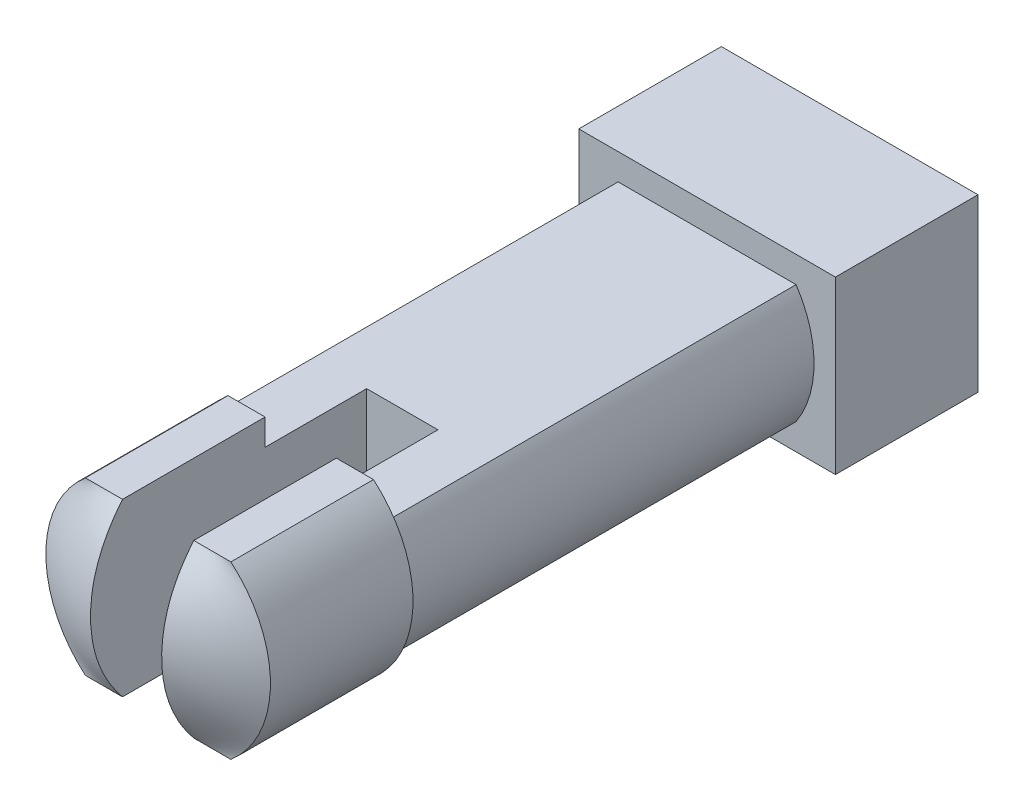
ISO-10303-21;
HEADER;
FILE_DESCRIPTION(('STEP AP214'),'2;1');
FILE_NAME('part.step','',(''),(''),'','','');
FILE_SCHEMA(('AUTOMOTIVE_DESIGN { 1 0 10303 214 1 1 1 1 }'));
ENDSEC;
DATA;
#1=APPLICATION_CONTEXT('core data for automotive mechanical design processes');
#2=APPLICATION_PROTOCOL_DEFINITION('international standard','automotive_design',2000,#1);
#3=PRODUCT_CONTEXT('',#1,'mechanical');
#4=PRODUCT('Part','Part','',(#3));
#5=PRODUCT_RELATED_PRODUCT_CATEGORY('part','',(#4));
#6=PRODUCT_DEFINITION_FORMATION('','',#4);
#7=PRODUCT_DEFINITION_CONTEXT('part definition',#1,'design');
#8=PRODUCT_DEFINITION('design','',#6,#7);
#9=PRODUCT_DEFINITION_SHAPE('','',#8);
#10=(LENGTH_UNIT() NAMED_UNIT(*) SI_UNIT(.MILLI.,.METRE.));
#11=(NAMED_UNIT(*) PLANE_ANGLE_UNIT() SI_UNIT($,.RADIAN.));
#12=(NAMED_UNIT(*) SI_UNIT($,.STERADIAN.) SOLID_ANGLE_UNIT());
#13=UNCERTAINTY_MEASURE_WITH_UNIT(LENGTH_MEASURE(1.E-05),#10,'distance_accuracy_value','');
#14=(GEOMETRIC_REPRESENTATION_CONTEXT(3) GLOBAL_UNCERTAINTY_ASSIGNED_CONTEXT((#13)) GLOBAL_UNIT_ASSIGNED_CONTEXT((#10,
#11,#12)) REPRESENTATION_CONTEXT('',''));
#15=CARTESIAN_POINT('',(0.,0.,0.));
#16=DIRECTION('',(0.,0.,1.));
#17=DIRECTION('',(1.,0.,0.));
#18=AXIS2_PLACEMENT_3D('',#15,#16,#17);
#19=CARTESIAN_POINT('',(0.,0.,19.558));
#20=DIRECTION('',(0.,0.,-1.));
#21=DIRECTION('',(-1.,0.,0.));
#22=AXIS2_PLACEMENT_3D('',#19,#20,#21);
#23=PLANE('',#22);
#24=DIRECTION('',(0.,-1.,0.));
#25=VECTOR('',#24,1.);
#26=CARTESIAN_POINT('',(1.27,0.,19.558));
#27=LINE('',#26,#25);
#28=CARTESIAN_POINT('',(1.27,3.048,19.558));
#29=VERTEX_POINT('',#28);
#30=CARTESIAN_POINT('',(1.27,2.11340774761812,19.558));
#31=VERTEX_POINT('',#30);
#32=EDGE_CURVE('E599',#29,#31,#27,.T.);
#33=ORIENTED_EDGE('',*,*,#32,.F.);
#34=DIRECTION('',(-1.,0.,0.));
#35=VECTOR('',#34,1.);
#36=CARTESIAN_POINT('',(-4.572,3.048,19.558));
#37=LINE('',#36,#35);
#38=CARTESIAN_POINT('',(2.5910801319141,3.048,19.558));
#39=VERTEX_POINT('',#38);
#40=EDGE_CURVE('E65',#39,#29,#37,.T.);
#41=ORIENTED_EDGE('',*,*,#40,.F.);
#42=CARTESIAN_POINT('',(0.,0.,19.558));
#43=DIRECTION('',(0.,0.,-1.));
#44=DIRECTION('',(-1.,0.,0.));
#45=AXIS2_PLACEMENT_3D('',#42,#43,#44);
#46=CIRCLE('',#45,4.0005);
#47=CARTESIAN_POINT('',(2.5910801319141,-3.048,19.558));
#48=VERTEX_POINT('',#47);
#49=EDGE_CURVE('E165',#39,#48,#46,.T.);
#50=ORIENTED_EDGE('',*,*,#49,.T.);
#51=DIRECTION('',(1.,0.,0.));
#52=VECTOR('',#51,1.);
#53=CARTESIAN_POINT('',(4.572,-3.048,19.558));
#54=LINE('',#53,#52);
#55=CARTESIAN_POINT('',(1.27,-3.048,19.558));
#56=VERTEX_POINT('',#55);
#57=EDGE_CURVE('E276',#56,#48,#54,.T.);
#58=ORIENTED_EDGE('',*,*,#57,.F.);
#59=CARTESIAN_POINT('',(1.27,-2.11340774761813,19.558));
#60=VERTEX_POINT('',#59);
#61=EDGE_CURVE('E597',#60,#56,#27,.T.);
#62=ORIENTED_EDGE('',*,*,#61,.F.);
#63=DIRECTION('',(1.,0.,0.));
#64=VECTOR('',#63,1.);
#65=CARTESIAN_POINT('',(-3.17011162142718,-2.11340774761813,19.558));
#66=LINE('',#65,#64);
#67=CARTESIAN_POINT('',(3.17011162142718,-2.11340774761812,19.558));
#68=VERTEX_POINT('',#67);
#69=EDGE_CURVE('E304',#60,#68,#66,.T.);
#70=ORIENTED_EDGE('',*,*,#69,.T.);
#71=CARTESIAN_POINT('',(0.,0.,19.558));
#72=DIRECTION('',(0.,0.,1.));
#73=DIRECTION('',(-1.,0.,0.));
#74=AXIS2_PLACEMENT_3D('',#71,#72,#73);
#75=CIRCLE('',#74,3.81);
#76=CARTESIAN_POINT('',(3.17011162142718,2.11340774761812,19.558));
#77=VERTEX_POINT('',#76);
#78=EDGE_CURVE('E306',#68,#77,#75,.T.);
#79=ORIENTED_EDGE('',*,*,#78,.T.);
#80=DIRECTION('',(-1.,0.,0.));
#81=VECTOR('',#80,1.);
#82=CARTESIAN_POINT('',(-3.17011162142718,2.11340774761812,19.558));
#83=LINE('',#82,#81);
#84=EDGE_CURVE('E310',#77,#31,#83,.T.);
#85=ORIENTED_EDGE('',*,*,#84,.T.);
#86=EDGE_LOOP('',(#33,#41,#50,#58,#62,#70,#79,#85));
#87=FACE_BOUND('',#86,.T.);
#88=ADVANCED_FACE('F38',(#87),#23,.T.);
#89=CARTESIAN_POINT('',(-2.5910801319141,-3.048,24.638));
#90=CARTESIAN_POINT('',(-0.863693377304702,-3.048,24.638));
#91=CARTESIAN_POINT('',(0.8636933773047,-3.048,24.638));
#92=CARTESIAN_POINT('',(2.5910801319141,-3.048,24.638));
#93=CARTESIAN_POINT('',(-4.6145251321818,-1.32788578142567,24.638));
#94=CARTESIAN_POINT('',(-1.5381750440606,-1.32788578142567,27.050654692375));
#95=CARTESIAN_POINT('',(1.5381750440606,-1.32788578142567,27.050654692375));
#96=CARTESIAN_POINT('',(4.61452513218179,-1.32788578142568,24.638));
#97=CARTESIAN_POINT('',(-4.61452513218179,1.32788578142568,24.638));
#98=CARTESIAN_POINT('',(-1.5381750440606,1.32788578142567,27.050654692375));
#99=CARTESIAN_POINT('',(1.5381750440606,1.32788578142567,27.1242265482653));
#100=CARTESIAN_POINT('',(4.6145251321818,1.32788578142567,24.638));
#101=CARTESIAN_POINT('',(-2.5910801319141,3.048,24.638));
#102=CARTESIAN_POINT('',(-0.8636933773047,3.048,24.638));
#103=CARTESIAN_POINT('',(0.863693377304702,3.048,24.638));
#104=CARTESIAN_POINT('',(2.5910801319141,3.048,24.638));
#105=(BOUNDED_SURFACE() B_SPLINE_SURFACE(3,3,((#89,#90,#91,#92),(#93,#94,#95,#96),(#97,#98,#99,
#100),(#101,#102,#103,#104)),.UNSPECIFIED.,.F.,.F.,.F.) B_SPLINE_SURFACE_WITH_KNOTS((4,4),(4,4),
(0.,1.),(0.,1.),.UNSPECIFIED.) GEOMETRIC_REPRESENTATION_ITEM() RATIONAL_B_SPLINE_SURFACE(((1.,
1.,1.,1.),(0.765126047896363,0.765126047896363,0.765126047896363,0.765126047896363),
(0.765126047896363,0.765126047896363,0.765126047896363,0.765126047896363),(1.,1.,1.,1.))) REPRESENTATION_ITEM('') SURFACE());
#106=CARTESIAN_POINT('',(1.27,-3.048,24.638));
#107=CARTESIAN_POINT('',(1.27,-3.00458500327321,24.6727504949667));
#108=CARTESIAN_POINT('',(1.27,-2.96089386099959,24.7071678880411));
#109=CARTESIAN_POINT('',(1.27,-2.87277313021113,24.775065923737));
#110=CARTESIAN_POINT('',(1.27,-2.82834335373755,24.8085463219221));
#111=CARTESIAN_POINT('',(1.27,-2.73848121865672,24.8743549790353));
#112=CARTESIAN_POINT('',(1.27,-2.6930468423728,24.9066804975642));
#113=CARTESIAN_POINT('',(1.27,-2.60122505357584,24.9699366480647));
#114=CARTESIAN_POINT('',(1.27,-2.5548377248211,25.0008674018699));
#115=CARTESIAN_POINT('',(1.27,-2.41416166654985,25.0914039420115));
#116=CARTESIAN_POINT('',(1.27,-2.31838770303796,25.1487326810203));
#117=CARTESIAN_POINT('',(1.27,-2.1231359077627,25.2565843633799));
#118=CARTESIAN_POINT('',(1.27,-2.02365969101949,25.307110230917));
#119=CARTESIAN_POINT('',(1.27,-1.82142861075274,25.4009111229785));
#120=CARTESIAN_POINT('',(1.27,-1.71867624235521,25.4441915157311));
#121=CARTESIAN_POINT('',(1.27,-1.51036995869101,25.5232069511139));
#122=CARTESIAN_POINT('',(1.27,-1.40481743066164,25.558945654223));
#123=CARTESIAN_POINT('',(1.27,-1.17476183536036,25.6276419702737));
#124=CARTESIAN_POINT('',(1.27,-1.04986799923013,25.6592991992556));
#125=CARTESIAN_POINT('',(1.27,-0.797856778005628,25.7120102227014));
#126=CARTESIAN_POINT('',(1.27,-0.670739226822252,25.733063221607));
#127=CARTESIAN_POINT('',(1.27,-0.415425316148469,25.7643686092299));
#128=CARTESIAN_POINT('',(1.27,-0.287231472276336,25.7746414910539));
#129=CARTESIAN_POINT('',(1.27,-0.0304419777011619,25.7843607403967));
#130=CARTESIAN_POINT('',(1.27,0.0981536457452551,25.7838078270466));
#131=CARTESIAN_POINT('',(1.27,0.354927267616464,25.7718421648942));
#132=CARTESIAN_POINT('',(1.27,0.483104923298805,25.7604220445866));
#133=CARTESIAN_POINT('',(1.27,0.738042304453518,25.7267457290753));
#134=CARTESIAN_POINT('',(1.27,0.864801904369178,25.7044885819931));
#135=CARTESIAN_POINT('',(1.27,1.1161545138105,25.6492133789829));
#136=CARTESIAN_POINT('',(1.27,1.24074390972599,25.6161789026141));
#137=CARTESIAN_POINT('',(1.27,1.48662350229105,25.5395769671217));
#138=CARTESIAN_POINT('',(1.27,1.60791442176924,25.49601183672));
#139=CARTESIAN_POINT('',(1.27,1.80716908005208,25.4146973178181));
#140=CARTESIAN_POINT('',(1.27,1.88628367518884,25.3797344950019));
#141=CARTESIAN_POINT('',(1.27,2.04241936238761,25.3053714340232));
#142=CARTESIAN_POINT('',(1.27,2.11944012188005,25.2659704959957));
#143=CARTESIAN_POINT('',(1.27,2.27119990842214,25.1829306203223));
#144=CARTESIAN_POINT('',(1.27,2.34593793652381,25.1392898612444));
#145=CARTESIAN_POINT('',(1.27,2.49285760700231,25.0481370435275));
#146=CARTESIAN_POINT('',(1.27,2.56504293690192,25.0006309262613));
#147=CARTESIAN_POINT('',(1.27,2.67147551471115,24.9267554758278));
#148=CARTESIAN_POINT('',(1.27,2.70664202406715,24.9016969339871));
#149=CARTESIAN_POINT('',(1.27,2.77639365783714,24.8507787067752));
#150=CARTESIAN_POINT('',(1.27,2.81097875428177,24.8249189830315));
#151=CARTESIAN_POINT('',(1.27,2.87955692575336,24.7725290632499));
#152=CARTESIAN_POINT('',(1.27000000000001,2.91355077699303,24.745999879389));
#153=CARTESIAN_POINT('',(1.26999999999999,2.98108798649202,24.6923834060631));
#154=CARTESIAN_POINT('',(1.26999999999995,3.01463140976077,24.6652961985984));
#155=CARTESIAN_POINT('',(1.26999999999987,3.048,24.638));
#156=B_SPLINE_CURVE_WITH_KNOTS('',3,(#106,#107,#108,#109,#110,#111,#112,#113,#114,#115,#116,
#117,#118,#119,#120,#121,#122,#123,#124,#125,#126,#127,#128,#129,#130,#131,#132,#133,#134,#135,
#136,#137,#138,#139,#140,#141,#142,#143,#144,#145,#146,#147,#148,#149,#150,#151,#152,#153,#154,
#155),.UNSPECIFIED.,.F.,.F.,(4,2,2,2,2,2,2,2,2,2,2,2,2,2,2,2,2,2,2,2,2,2,2,2,4),(0.,
0.166839293265474,0.333721712141065,0.500976872944534,0.668217395479844,1.00280584715987,
1.33725001505932,1.67144528338264,2.00547796972887,2.39154290804202,2.77763680568337,
3.16299539806703,3.5483283921058,3.93392295385967,4.31955139071602,4.70577014028944,
5.09190356044414,5.35126285185365,5.6106631001248,5.87017528399577,6.12929585048003,
6.25883005810055,6.38837047934608,6.51772556711767,6.64706178018432),.UNSPECIFIED.);
#157=CARTESIAN_POINT('',(1.27,-3.048,24.638));
#158=VERTEX_POINT('',#157);
#159=CARTESIAN_POINT('',(1.27,3.048,24.638));
#160=VERTEX_POINT('',#159);
#161=EDGE_CURVE('E197',#158,#160,#156,.T.);
#162=DIRECTION('',(1.,0.,0.));
#163=VECTOR('',#162,1.);
#164=CARTESIAN_POINT('',(-2.5910801319141,-3.048,24.638));
#165=LINE('',#164,#163);
#166=CARTESIAN_POINT('',(2.5910801319141,-3.048,24.638));
#167=VERTEX_POINT('',#166);
#168=EDGE_CURVE('E170',#158,#167,#165,.T.);
#169=CARTESIAN_POINT('',(0.,0.,24.638));
#170=DIRECTION('',(0.,0.,1.));
#171=DIRECTION('',(-1.,0.,0.));
#172=AXIS2_PLACEMENT_3D('',#169,#170,#171);
#173=CIRCLE('',#172,4.0005);
#174=CARTESIAN_POINT('',(2.5910801319141,3.048,24.638));
#175=VERTEX_POINT('',#174);
#176=EDGE_CURVE('E177',#167,#175,#173,.T.);
#177=DIRECTION('',(-1.,0.,0.));
#178=VECTOR('',#177,1.);
#179=CARTESIAN_POINT('',(-2.5910801319141,3.048,24.638));
#180=LINE('',#179,#178);
#181=EDGE_CURVE('E172',#175,#160,#180,.T.);
#182=ORIENTED_EDGE('',*,*,#161,.F.);
#183=ORIENTED_EDGE('',*,*,#168,.T.);
#184=ORIENTED_EDGE('',*,*,#176,.T.);
#185=ORIENTED_EDGE('',*,*,#181,.T.);
#186=EDGE_LOOP('',(#182,#183,#184,#185));
#187=FACE_BOUND('',#186,.T.);
#188=ADVANCED_FACE('F195',(#187),#105,.F.);
#189=CARTESIAN_POINT('',(-4.572,-3.048,5.08));
#190=DIRECTION('',(0.,1.,0.));
#191=DIRECTION('',(0.,0.,1.));
#192=AXIS2_PLACEMENT_3D('',#189,#190,#191);
#193=PLANE('',#192);
#194=ORIENTED_EDGE('',*,*,#168,.F.);
#195=DIRECTION('',(0.,0.,1.));
#196=VECTOR('',#195,1.);
#197=CARTESIAN_POINT('',(1.27,-3.048,15.9385));
#198=LINE('',#197,#196);
#199=EDGE_CURVE('E388',#56,#158,#198,.T.);
#200=ORIENTED_EDGE('',*,*,#199,.F.);
#201=ORIENTED_EDGE('',*,*,#57,.T.);
#202=DIRECTION('',(0.,0.,-1.));
#203=VECTOR('',#202,1.);
#204=CARTESIAN_POINT('',(2.5910801319141,-3.048,24.638));
#205=LINE('',#204,#203);
#206=EDGE_CURVE('E154',#167,#48,#205,.T.);
#207=ORIENTED_EDGE('',*,*,#206,.F.);
#208=EDGE_LOOP('',(#194,#200,#201,#207));
#209=FACE_BOUND('',#208,.T.);
#210=ADVANCED_FACE('F238',(#209),#193,.F.);
#211=CARTESIAN_POINT('',(-4.572,3.048,5.08));
#212=DIRECTION('',(0.,-1.,0.));
#213=DIRECTION('',(0.,0.,-1.));
#214=AXIS2_PLACEMENT_3D('',#211,#212,#213);
#215=PLANE('',#214);
#216=ORIENTED_EDGE('',*,*,#40,.T.);
#217=DIRECTION('',(0.,0.,1.));
#218=VECTOR('',#217,1.);
#219=CARTESIAN_POINT('',(1.27,3.048,5.08));
#220=LINE('',#219,#218);
#221=EDGE_CURVE('E49',#29,#160,#220,.T.);
#222=ORIENTED_EDGE('',*,*,#221,.T.);
#223=ORIENTED_EDGE('',*,*,#181,.F.);
#224=DIRECTION('',(0.,0.,-1.));
#225=VECTOR('',#224,1.);
#226=CARTESIAN_POINT('',(2.5910801319141,3.048,24.638));
#227=LINE('',#226,#225);
#228=EDGE_CURVE('E204',#175,#39,#227,.T.);
#229=ORIENTED_EDGE('',*,*,#228,.T.);
#230=EDGE_LOOP('',(#216,#222,#223,#229));
#231=FACE_BOUND('',#230,.T.);
#232=ADVANCED_FACE('F185',(#231),#215,.F.);
#233=DIRECTION('',(0.,0.,-1.));
#234=VECTOR('',#233,1.);
#235=CARTESIAN_POINT('',(-4.572,3.048,5.08));
#236=LINE('',#235,#234);
#237=CARTESIAN_POINT('',(-4.572,3.048,5.08));
#238=VERTEX_POINT('',#237);
#239=CARTESIAN_POINT('',(-4.572,3.048,0.));
#240=VERTEX_POINT('',#239);
#241=EDGE_CURVE('E161',#238,#240,#236,.T.);
#242=ORIENTED_EDGE('',*,*,#241,.F.);
#243=DIRECTION('',(-1.,0.,0.));
#244=VECTOR('',#243,1.);
#245=CARTESIAN_POINT('',(-4.572,3.048,5.08));
#246=LINE('',#245,#244);
#247=CARTESIAN_POINT('',(4.572,3.048,5.08));
#248=VERTEX_POINT('',#247);
#249=EDGE_CURVE('E213',#248,#238,#246,.T.);
#250=ORIENTED_EDGE('',*,*,#249,.F.);
#251=DIRECTION('',(0.,0.,-1.));
#252=VECTOR('',#251,1.);
#253=CARTESIAN_POINT('',(4.572,3.048,5.08));
#254=LINE('',#253,#252);
#255=CARTESIAN_POINT('',(4.572,3.048,0.));
#256=VERTEX_POINT('',#255);
#257=EDGE_CURVE('E163',#248,#256,#254,.T.);
#258=ORIENTED_EDGE('',*,*,#257,.T.);
#259=DIRECTION('',(-1.,0.,0.));
#260=VECTOR('',#259,1.);
#261=CARTESIAN_POINT('',(-4.572,3.048,0.));
#262=LINE('',#261,#260);
#263=EDGE_CURVE('E149',#256,#240,#262,.T.);
#264=ORIENTED_EDGE('',*,*,#263,.T.);
#265=EDGE_LOOP('',(#242,#250,#258,#264));
#266=FACE_BOUND('',#265,.T.);
#267=ADVANCED_FACE('F221',(#266),#215,.F.);
#268=DIRECTION('',(0.,0.,-1.));
#269=VECTOR('',#268,1.);
#270=CARTESIAN_POINT('',(4.572,-3.048,5.08));
#271=LINE('',#270,#269);
#272=CARTESIAN_POINT('',(4.572,-3.048,5.08));
#273=VERTEX_POINT('',#272);
#274=CARTESIAN_POINT('',(4.572,-3.048,0.));
#275=VERTEX_POINT('',#274);
#276=EDGE_CURVE('E133',#273,#275,#271,.T.);
#277=ORIENTED_EDGE('',*,*,#276,.F.);
#278=DIRECTION('',(1.,0.,0.));
#279=VECTOR('',#278,1.);
#280=CARTESIAN_POINT('',(-4.572,-3.048,5.08));
#281=LINE('',#280,#279);
#282=CARTESIAN_POINT('',(-4.572,-3.048,5.08));
#283=VERTEX_POINT('',#282);
#284=EDGE_CURVE('E146',#283,#273,#281,.T.);
#285=ORIENTED_EDGE('',*,*,#284,.F.);
#286=DIRECTION('',(0.,0.,-1.));
#287=VECTOR('',#286,1.);
#288=CARTESIAN_POINT('',(-4.572,-3.048,5.08));
#289=LINE('',#288,#287);
#290=CARTESIAN_POINT('',(-4.572,-3.048,0.));
#291=VERTEX_POINT('',#290);
#292=EDGE_CURVE('E135',#283,#291,#289,.T.);
#293=ORIENTED_EDGE('',*,*,#292,.T.);
#294=DIRECTION('',(1.,0.,0.));
#295=VECTOR('',#294,1.);
#296=CARTESIAN_POINT('',(-4.572,-3.048,0.));
#297=LINE('',#296,#295);
#298=EDGE_CURVE('E129',#291,#275,#297,.T.);
#299=ORIENTED_EDGE('',*,*,#298,.T.);
#300=EDGE_LOOP('',(#277,#285,#293,#299));
#301=FACE_BOUND('',#300,.T.);
#302=ADVANCED_FACE('F131',(#301),#193,.F.);
#303=CARTESIAN_POINT('',(4.572,3.048,5.08));
#304=DIRECTION('',(-1.,0.,0.));
#305=DIRECTION('',(0.,0.,1.));
#306=AXIS2_PLACEMENT_3D('',#303,#304,#305);
#307=PLANE('',#306);
#308=DIRECTION('',(0.,1.,0.));
#309=VECTOR('',#308,1.);
#310=CARTESIAN_POINT('',(4.572,3.048,0.));
#311=LINE('',#310,#309);
#312=EDGE_CURVE('E144',#275,#256,#311,.T.);
#313=ORIENTED_EDGE('',*,*,#312,.T.);
#314=ORIENTED_EDGE('',*,*,#257,.F.);
#315=DIRECTION('',(0.,1.,0.));
#316=VECTOR('',#315,1.);
#317=CARTESIAN_POINT('',(4.572,3.048,5.08));
#318=LINE('',#317,#316);
#319=EDGE_CURVE('E138',#273,#248,#318,.T.);
#320=ORIENTED_EDGE('',*,*,#319,.F.);
#321=ORIENTED_EDGE('',*,*,#276,.T.);
#322=EDGE_LOOP('',(#313,#314,#320,#321));
#323=FACE_BOUND('',#322,.T.);
#324=ADVANCED_FACE('F142',(#323),#307,.F.);
#325=CARTESIAN_POINT('',(-4.572,3.048,5.08));
#326=DIRECTION('',(1.,0.,0.));
#327=DIRECTION('',(0.,1.,0.));
#328=AXIS2_PLACEMENT_3D('',#325,#326,#327);
#329=PLANE('',#328);
#330=DIRECTION('',(0.,-1.,0.));
#331=VECTOR('',#330,1.);
#332=CARTESIAN_POINT('',(-4.572,3.048,0.));
#333=LINE('',#332,#331);
#334=EDGE_CURVE('E123',#240,#291,#333,.T.);
#335=ORIENTED_EDGE('',*,*,#334,.T.);
#336=ORIENTED_EDGE('',*,*,#292,.F.);
#337=DIRECTION('',(0.,-1.,0.));
#338=VECTOR('',#337,1.);
#339=CARTESIAN_POINT('',(-4.572,3.048,5.08));
#340=LINE('',#339,#338);
#341=EDGE_CURVE('E214',#238,#283,#340,.T.);
#342=ORIENTED_EDGE('',*,*,#341,.F.);
#343=ORIENTED_EDGE('',*,*,#241,.T.);
#344=EDGE_LOOP('',(#335,#336,#342,#343));
#345=FACE_BOUND('',#344,.T.);
#346=ADVANCED_FACE('F222',(#345),#329,.F.);
#347=CARTESIAN_POINT('',(0.,0.,5.08));
#348=DIRECTION('',(0.,0.,1.));
#349=DIRECTION('',(1.,0.,0.));
#350=AXIS2_PLACEMENT_3D('',#347,#348,#349);
#351=PLANE('',#350);
#352=ORIENTED_EDGE('',*,*,#249,.T.);
#353=ORIENTED_EDGE('',*,*,#341,.T.);
#354=ORIENTED_EDGE('',*,*,#284,.T.);
#355=ORIENTED_EDGE('',*,*,#319,.T.);
#356=EDGE_LOOP('',(#352,#353,#354,#355));
#357=FACE_BOUND('',#356,.T.);
#358=DIRECTION('',(-1.,0.,0.));
#359=VECTOR('',#358,1.);
#360=CARTESIAN_POINT('',(-3.17011162142718,-2.11340774761813,5.08));
#361=LINE('',#360,#359);
#362=CARTESIAN_POINT('',(3.17011162142718,-2.11340774761813,5.08));
#363=VERTEX_POINT('',#362);
#364=CARTESIAN_POINT('',(-3.17011162142718,-2.11340774761813,5.08));
#365=VERTEX_POINT('',#364);
#366=EDGE_CURVE('E284',#363,#365,#361,.T.);
#367=ORIENTED_EDGE('',*,*,#366,.T.);
#368=CARTESIAN_POINT('',(0.,0.,5.08));
#369=DIRECTION('',(0.,0.,1.));
#370=DIRECTION('',(1.,0.,0.));
#371=AXIS2_PLACEMENT_3D('',#368,#369,#370);
#372=CIRCLE('',#371,3.81);
#373=CARTESIAN_POINT('',(-3.17011162142718,2.11340774761812,5.08));
#374=VERTEX_POINT('',#373);
#375=EDGE_CURVE('E286',#365,#374,#372,.F.);
#376=ORIENTED_EDGE('',*,*,#375,.T.);
#377=DIRECTION('',(1.,0.,0.));
#378=VECTOR('',#377,1.);
#379=CARTESIAN_POINT('',(-3.17011162142718,2.11340774761812,5.08));
#380=LINE('',#379,#378);
#381=CARTESIAN_POINT('',(3.17011162142718,2.11340774761812,5.08));
#382=VERTEX_POINT('',#381);
#383=EDGE_CURVE('E289',#374,#382,#380,.T.);
#384=ORIENTED_EDGE('',*,*,#383,.T.);
#385=CARTESIAN_POINT('',(0.,0.,5.08));
#386=DIRECTION('',(0.,0.,1.));
#387=DIRECTION('',(1.,0.,0.));
#388=AXIS2_PLACEMENT_3D('',#385,#386,#387);
#389=CIRCLE('',#388,3.81);
#390=EDGE_CURVE('E287',#382,#363,#389,.F.);
#391=ORIENTED_EDGE('',*,*,#390,.T.);
#392=EDGE_LOOP('',(#367,#376,#384,#391));
#393=FACE_BOUND('',#392,.T.);
#394=ADVANCED_FACE('F217',(#357,#393),#351,.T.);
#395=CARTESIAN_POINT('',(0.,0.,0.));
#396=DIRECTION('',(0.,0.,1.));
#397=DIRECTION('',(1.,0.,0.));
#398=AXIS2_PLACEMENT_3D('',#395,#396,#397);
#399=PLANE('',#398);
#400=ORIENTED_EDGE('',*,*,#312,.F.);
#401=ORIENTED_EDGE('',*,*,#298,.F.);
#402=ORIENTED_EDGE('',*,*,#334,.F.);
#403=ORIENTED_EDGE('',*,*,#263,.F.);
#404=EDGE_LOOP('',(#400,#401,#402,#403));
#405=FACE_BOUND('',#404,.T.);
#406=ADVANCED_FACE('F148',(#405),#399,.F.);
#407=DIRECTION('',(0.,1.,0.));
#408=VECTOR('',#407,1.);
#409=CARTESIAN_POINT('',(-1.27,0.,19.558));
#410=LINE('',#409,#408);
#411=CARTESIAN_POINT('',(-1.27,-3.048,19.558));
#412=VERTEX_POINT('',#411);
#413=CARTESIAN_POINT('',(-1.27,-2.11340774761813,19.558));
#414=VERTEX_POINT('',#413);
#415=EDGE_CURVE('E257',#412,#414,#410,.T.);
#416=ORIENTED_EDGE('',*,*,#415,.F.);
#417=CARTESIAN_POINT('',(-2.5910801319141,-3.048,19.558));
#418=VERTEX_POINT('',#417);
#419=EDGE_CURVE('E259',#418,#412,#54,.T.);
#420=ORIENTED_EDGE('',*,*,#419,.F.);
#421=CARTESIAN_POINT('',(0.,0.,19.558));
#422=DIRECTION('',(0.,0.,-1.));
#423=DIRECTION('',(-1.,0.,0.));
#424=AXIS2_PLACEMENT_3D('',#421,#422,#423);
#425=CIRCLE('',#424,4.0005);
#426=CARTESIAN_POINT('',(-2.5910801319141,3.048,19.558));
#427=VERTEX_POINT('',#426);
#428=EDGE_CURVE('E171',#418,#427,#425,.T.);
#429=ORIENTED_EDGE('',*,*,#428,.T.);
#430=CARTESIAN_POINT('',(-1.27,3.048,19.558));
#431=VERTEX_POINT('',#430);
#432=EDGE_CURVE('E98',#431,#427,#37,.T.);
#433=ORIENTED_EDGE('',*,*,#432,.F.);
#434=CARTESIAN_POINT('',(-1.27,2.11340774761812,19.558));
#435=VERTEX_POINT('',#434);
#436=EDGE_CURVE('E56',#435,#431,#410,.T.);
#437=ORIENTED_EDGE('',*,*,#436,.F.);
#438=CARTESIAN_POINT('',(-3.17011162142718,2.11340774761812,19.558));
#439=VERTEX_POINT('',#438);
#440=EDGE_CURVE('E309',#435,#439,#83,.T.);
#441=ORIENTED_EDGE('',*,*,#440,.T.);
#442=CARTESIAN_POINT('',(0.,0.,19.558));
#443=DIRECTION('',(0.,0.,1.));
#444=DIRECTION('',(1.,0.,0.));
#445=AXIS2_PLACEMENT_3D('',#442,#443,#444);
#446=CIRCLE('',#445,3.81);
#447=CARTESIAN_POINT('',(-3.17011162142718,-2.11340774761813,19.558));
#448=VERTEX_POINT('',#447);
#449=EDGE_CURVE('E302',#439,#448,#446,.T.);
#450=ORIENTED_EDGE('',*,*,#449,.T.);
#451=EDGE_CURVE('E264',#448,#414,#66,.T.);
#452=ORIENTED_EDGE('',*,*,#451,.T.);
#453=EDGE_LOOP('',(#416,#420,#429,#433,#437,#441,#450,#452));
#454=FACE_BOUND('',#453,.T.);
#455=ADVANCED_FACE('F234',(#454),#23,.T.);
#456=CARTESIAN_POINT('',(-3.17011162142718,-2.11340774761813,-5.90972028761424));
#457=DIRECTION('',(0.,-1.,0.));
#458=DIRECTION('',(0.,0.,-1.));
#459=AXIS2_PLACEMENT_3D('',#456,#457,#458);
#460=PLANE('',#459);
#461=DIRECTION('',(0.,0.,1.));
#462=VECTOR('',#461,1.);
#463=CARTESIAN_POINT('',(1.27,-2.11340774761813,-5.90972028761424));
#464=LINE('',#463,#462);
#465=CARTESIAN_POINT('',(1.27,-2.11340774761813,15.9385));
#466=VERTEX_POINT('',#465);
#467=EDGE_CURVE('E598',#466,#60,#464,.T.);
#468=ORIENTED_EDGE('',*,*,#467,.F.);
#469=DIRECTION('',(1.,0.,0.));
#470=VECTOR('',#469,1.);
#471=CARTESIAN_POINT('',(-3.17011162142718,-2.11340774761813,15.9385));
#472=LINE('',#471,#470);
#473=CARTESIAN_POINT('',(-1.27,-2.11340774761813,15.9385));
#474=VERTEX_POINT('',#473);
#475=EDGE_CURVE('E297',#474,#466,#472,.T.);
#476=ORIENTED_EDGE('',*,*,#475,.F.);
#477=DIRECTION('',(0.,0.,-1.));
#478=VECTOR('',#477,1.);
#479=CARTESIAN_POINT('',(-1.27,-2.11340774761813,-5.90972028761424));
#480=LINE('',#479,#478);
#481=EDGE_CURVE('E271',#414,#474,#480,.T.);
#482=ORIENTED_EDGE('',*,*,#481,.F.);
#483=ORIENTED_EDGE('',*,*,#451,.F.);
#484=DIRECTION('',(0.,0.,1.));
#485=VECTOR('',#484,1.);
#486=CARTESIAN_POINT('',(-3.17011162142718,-2.11340774761813,-5.90972028761424));
#487=LINE('',#486,#485);
#488=EDGE_CURVE('E281',#365,#448,#487,.T.);
#489=ORIENTED_EDGE('',*,*,#488,.F.);
#490=ORIENTED_EDGE('',*,*,#366,.F.);
#491=DIRECTION('',(0.,0.,1.));
#492=VECTOR('',#491,1.);
#493=CARTESIAN_POINT('',(3.17011162142718,-2.11340774761812,-5.90972028761424));
#494=LINE('',#493,#492);
#495=EDGE_CURVE('E317',#363,#68,#494,.T.);
#496=ORIENTED_EDGE('',*,*,#495,.T.);
#497=ORIENTED_EDGE('',*,*,#69,.F.);
#498=EDGE_LOOP('',(#468,#476,#482,#483,#489,#490,#496,#497));
#499=FACE_BOUND('',#498,.T.);
#500=ADVANCED_FACE('F242',(#499),#460,.T.);
#501=CARTESIAN_POINT('',(0.,0.,-5.90972028761424));
#502=DIRECTION('',(0.,0.,1.));
#503=DIRECTION('',(1.,0.,0.));
#504=AXIS2_PLACEMENT_3D('',#501,#502,#503);
#505=CYLINDRICAL_SURFACE('',#504,3.81);
#506=DIRECTION('',(0.,0.,1.));
#507=VECTOR('',#506,1.);
#508=CARTESIAN_POINT('',(3.17011162142718,2.11340774761812,-5.90972028761424));
#509=LINE('',#508,#507);
#510=EDGE_CURVE('E315',#382,#77,#509,.T.);
#511=ORIENTED_EDGE('',*,*,#510,.T.);
#512=ORIENTED_EDGE('',*,*,#78,.F.);
#513=ORIENTED_EDGE('',*,*,#495,.F.);
#514=ORIENTED_EDGE('',*,*,#390,.F.);
#515=EDGE_LOOP('',(#511,#512,#513,#514));
#516=FACE_BOUND('',#515,.T.);
#517=ADVANCED_FACE('F248',(#516),#505,.T.);
#518=CARTESIAN_POINT('',(-3.17011162142718,2.11340774761812,-5.90972028761424));
#519=DIRECTION('',(0.,1.,0.));
#520=DIRECTION('',(-1.,0.,0.));
#521=AXIS2_PLACEMENT_3D('',#518,#519,#520);
#522=PLANE('',#521);
#523=DIRECTION('',(0.,0.,-1.));
#524=VECTOR('',#523,1.);
#525=CARTESIAN_POINT('',(1.27,2.11340774761812,-5.90972028761424));
#526=LINE('',#525,#524);
#527=CARTESIAN_POINT('',(1.27,2.11340774761812,15.9385));
#528=VERTEX_POINT('',#527);
#529=EDGE_CURVE('E355',#31,#528,#526,.T.);
#530=ORIENTED_EDGE('',*,*,#529,.F.);
#531=ORIENTED_EDGE('',*,*,#84,.F.);
#532=ORIENTED_EDGE('',*,*,#510,.F.);
#533=ORIENTED_EDGE('',*,*,#383,.F.);
#534=DIRECTION('',(0.,0.,1.));
#535=VECTOR('',#534,1.);
#536=CARTESIAN_POINT('',(-3.17011162142718,2.11340774761812,-5.90972028761424));
#537=LINE('',#536,#535);
#538=EDGE_CURVE('E279',#374,#439,#537,.T.);
#539=ORIENTED_EDGE('',*,*,#538,.T.);
#540=ORIENTED_EDGE('',*,*,#440,.F.);
#541=DIRECTION('',(0.,0.,1.));
#542=VECTOR('',#541,1.);
#543=CARTESIAN_POINT('',(-1.27,2.11340774761812,-5.90972028761424));
#544=LINE('',#543,#542);
#545=CARTESIAN_POINT('',(-1.27,2.11340774761812,15.9385));
#546=VERTEX_POINT('',#545);
#547=EDGE_CURVE('E346',#546,#435,#544,.T.);
#548=ORIENTED_EDGE('',*,*,#547,.F.);
#549=DIRECTION('',(-1.,0.,0.));
#550=VECTOR('',#549,1.);
#551=CARTESIAN_POINT('',(-3.17011162142718,2.11340774761812,15.9385));
#552=LINE('',#551,#550);
#553=EDGE_CURVE('E11',#528,#546,#552,.T.);
#554=ORIENTED_EDGE('',*,*,#553,.F.);
#555=EDGE_LOOP('',(#530,#531,#532,#533,#539,#540,#548,#554));
#556=FACE_BOUND('',#555,.T.);
#557=ADVANCED_FACE('F366',(#556),#522,.T.);
#558=CARTESIAN_POINT('',(0.,0.,-5.90972028761424));
#559=DIRECTION('',(0.,0.,1.));
#560=DIRECTION('',(1.,0.,0.));
#561=AXIS2_PLACEMENT_3D('',#558,#559,#560);
#562=CYLINDRICAL_SURFACE('',#561,3.81);
#563=ORIENTED_EDGE('',*,*,#488,.T.);
#564=ORIENTED_EDGE('',*,*,#449,.F.);
#565=ORIENTED_EDGE('',*,*,#538,.F.);
#566=ORIENTED_EDGE('',*,*,#375,.F.);
#567=EDGE_LOOP('',(#563,#564,#565,#566));
#568=FACE_BOUND('',#567,.T.);
#569=ADVANCED_FACE('F329',(#568),#562,.T.);
#570=CARTESIAN_POINT('',(-1.27,3.048,24.638));
#571=CARTESIAN_POINT('',(-1.27,3.00541540902938,24.6723485216203));
#572=CARTESIAN_POINT('',(-1.27,2.96255477866502,24.7063662981467));
#573=CARTESIAN_POINT('',(-1.27,2.87610092037041,24.7734791723055));
#574=CARTESIAN_POINT('',(-1.27,2.83250750727115,24.8065740309301));
#575=CARTESIAN_POINT('',(-1.27,2.744333203988,24.8716328391362));
#576=CARTESIAN_POINT('',(-1.27,2.69975036761388,24.903594164995));
#577=CARTESIAN_POINT('',(-1.27,2.60964285208239,24.9661490007697));
#578=CARTESIAN_POINT('',(-1.27,2.56411825486159,24.9967426289543));
#579=CARTESIAN_POINT('',(-1.27,2.42604992405147,25.086309487261));
#580=CARTESIAN_POINT('',(-1.27,2.33203777238801,25.1430492289848));
#581=CARTESIAN_POINT('',(-1.27,2.14042140303452,25.2498042465661));
#582=CARTESIAN_POINT('',(-1.27,2.0428217234857,25.2998276692071));
#583=CARTESIAN_POINT('',(-1.27,1.84437546520534,25.3927674428047));
#584=CARTESIAN_POINT('',(-1.27,1.74353130993547,25.4356889577863));
#585=CARTESIAN_POINT('',(-1.27,1.53906656327599,25.5141440137061));
#586=CARTESIAN_POINT('',(-1.27,1.43544729755185,25.54968101358));
#587=CARTESIAN_POINT('',(-1.27,1.20759103950463,25.6187355734139));
#588=CARTESIAN_POINT('',(-1.27,1.08291532181485,25.6508150760783));
#589=CARTESIAN_POINT('',(-1.27,0.831289841571873,25.7043026484292));
#590=CARTESIAN_POINT('',(-1.27,0.704339876884446,25.7257097646342));
#591=CARTESIAN_POINT('',(-1.27,0.449306480273879,25.7577020796041));
#592=CARTESIAN_POINT('',(-1.27,0.321225389048588,25.7683059351983));
#593=CARTESIAN_POINT('',(-1.27,0.0646351154392668,25.7787121750421));
#594=CARTESIAN_POINT('',(-1.27,-0.0638740367124837,25.7785153065824));
#595=CARTESIAN_POINT('',(-1.27,-0.320394646637235,25.7673464629178));
#596=CARTESIAN_POINT('',(-1.27,-0.448406207367436,25.756376850536));
#597=CARTESIAN_POINT('',(-1.27,-0.703071257576576,25.7237517652908));
#598=CARTESIAN_POINT('',(-1.27,-0.829724629347547,25.7020953737793));
#599=CARTESIAN_POINT('',(-1.27,-1.08097565653142,25.6482100720807));
#600=CARTESIAN_POINT('',(-1.27,-1.2055696684552,25.6159641728815));
#601=CARTESIAN_POINT('',(-1.27,-1.45159365824385,25.5411601853379));
#602=CARTESIAN_POINT('',(-1.27,-1.57302427620981,25.4986042014359));
#603=CARTESIAN_POINT('',(-1.27,-1.81545284698904,25.4021321546333));
#604=CARTESIAN_POINT('',(-1.27,-1.93633186324191,25.3479174245186));
#605=CARTESIAN_POINT('',(-1.27,-2.17315569103077,25.2294724872682));
#606=CARTESIAN_POINT('',(-1.27,-2.2890981136584,25.1652374997164));
#607=CARTESIAN_POINT('',(-1.27,-2.45873711144829,25.0621742076297));
#608=CARTESIAN_POINT('',(-1.27,-2.51452531611022,25.0267343320078));
#609=CARTESIAN_POINT('',(-1.27,-2.62473421469734,24.9537696596849));
#610=CARTESIAN_POINT('',(-1.27,-2.67915473220432,24.9162445959995));
#611=CARTESIAN_POINT('',(-1.27,-2.78661001077214,24.8393965363952));
#612=CARTESIAN_POINT('',(-1.26999999999999,-2.83964631615198,24.8000756916497));
#613=CARTESIAN_POINT('',(-1.27000000000001,-2.91834561035208,24.740000281134));
#614=CARTESIAN_POINT('',(-1.27000000000002,-2.94443205534603,24.7197961236192));
#615=CARTESIAN_POINT('',(-1.26999999999998,-2.99637477175617,24.6790974439287));
#616=CARTESIAN_POINT('',(-1.26999999999994,-3.02223105887957,24.658602941819));
#617=CARTESIAN_POINT('',(-1.26999999999984,-3.048,24.638));
#618=B_SPLINE_CURVE_WITH_KNOTS('',3,(#570,#571,#572,#573,#574,#575,#576,#577,#578,#579,#580,
#581,#582,#583,#584,#585,#586,#587,#588,#589,#590,#591,#592,#593,#594,#595,#596,#597,#598,#599,
#600,#601,#602,#603,#604,#605,#606,#607,#608,#609,#610,#611,#612,#613,#614,#615,#616,#617),
.UNSPECIFIED.,.F.,.F.,(4,2,2,2,2,2,2,2,2,2,2,2,2,2,2,2,2,2,2,2,2,2,2,4),(0.,0.164141590336763,
0.328325300922407,0.492867068620794,0.657394580310217,0.986547150740211,1.31529678626858,
1.64380631677584,1.97216162354552,2.35789581076287,2.74366445367939,3.12876575339649,
3.51384040839071,3.89883062249125,4.28385393656319,4.66949799571776,5.05506340537685,
5.45202823973283,5.84918303863789,6.04742313124518,6.2456886649814,6.44372262500954,
6.54270777827328,6.64168612365511),.UNSPECIFIED.);
#619=CARTESIAN_POINT('',(-1.27,3.048,24.638));
#620=VERTEX_POINT('',#619);
#621=CARTESIAN_POINT('',(-1.27,-3.048,24.638));
#622=VERTEX_POINT('',#621);
#623=EDGE_CURVE('E385',#620,#622,#618,.T.);
#624=CARTESIAN_POINT('',(-2.5910801319141,3.048,24.638));
#625=VERTEX_POINT('',#624);
#626=EDGE_CURVE('E176',#620,#625,#180,.T.);
#627=CARTESIAN_POINT('',(0.,0.,24.638));
#628=DIRECTION('',(0.,0.,1.));
#629=DIRECTION('',(1.,0.,0.));
#630=AXIS2_PLACEMENT_3D('',#627,#628,#629);
#631=CIRCLE('',#630,4.0005);
#632=CARTESIAN_POINT('',(-2.5910801319141,-3.048,24.638));
#633=VERTEX_POINT('',#632);
#634=EDGE_CURVE('E168',#625,#633,#631,.T.);
#635=EDGE_CURVE('E90',#633,#622,#165,.T.);
#636=ORIENTED_EDGE('',*,*,#623,.F.);
#637=ORIENTED_EDGE('',*,*,#626,.T.);
#638=ORIENTED_EDGE('',*,*,#634,.T.);
#639=ORIENTED_EDGE('',*,*,#635,.T.);
#640=EDGE_LOOP('',(#636,#637,#638,#639));
#641=FACE_BOUND('',#640,.T.);
#642=ADVANCED_FACE('F40',(#641),#105,.F.);
#643=CARTESIAN_POINT('',(0.,0.,24.638));
#644=DIRECTION('',(0.,0.,-1.));
#645=DIRECTION('',(-1.,0.,0.));
#646=AXIS2_PLACEMENT_3D('',#643,#644,#645);
#647=CYLINDRICAL_SURFACE('',#646,4.0005);
#648=ORIENTED_EDGE('',*,*,#428,.F.);
#649=DIRECTION('',(0.,0.,-1.));
#650=VECTOR('',#649,1.);
#651=CARTESIAN_POINT('',(-2.5910801319141,-3.048,24.638));
#652=LINE('',#651,#650);
#653=EDGE_CURVE('E151',#633,#418,#652,.T.);
#654=ORIENTED_EDGE('',*,*,#653,.F.);
#655=ORIENTED_EDGE('',*,*,#634,.F.);
#656=DIRECTION('',(0.,0.,-1.));
#657=VECTOR('',#656,1.);
#658=CARTESIAN_POINT('',(-2.5910801319141,3.048,24.638));
#659=LINE('',#658,#657);
#660=EDGE_CURVE('E175',#625,#427,#659,.T.);
#661=ORIENTED_EDGE('',*,*,#660,.T.);
#662=EDGE_LOOP('',(#648,#654,#655,#661));
#663=FACE_BOUND('',#662,.T.);
#664=ADVANCED_FACE('F376',(#663),#647,.T.);
#665=CARTESIAN_POINT('',(0.,0.,24.638));
#666=DIRECTION('',(0.,0.,-1.));
#667=DIRECTION('',(-1.,0.,0.));
#668=AXIS2_PLACEMENT_3D('',#665,#666,#667);
#669=CYLINDRICAL_SURFACE('',#668,4.0005);
#670=ORIENTED_EDGE('',*,*,#49,.F.);
#671=ORIENTED_EDGE('',*,*,#228,.F.);
#672=ORIENTED_EDGE('',*,*,#176,.F.);
#673=ORIENTED_EDGE('',*,*,#206,.T.);
#674=EDGE_LOOP('',(#670,#671,#672,#673));
#675=FACE_BOUND('',#674,.T.);
#676=ADVANCED_FACE('F205',(#675),#669,.T.);
#677=ORIENTED_EDGE('',*,*,#419,.T.);
#678=DIRECTION('',(0.,0.,-1.));
#679=VECTOR('',#678,1.);
#680=CARTESIAN_POINT('',(-1.27,-3.048,15.9385));
#681=LINE('',#680,#679);
#682=EDGE_CURVE('E274',#622,#412,#681,.T.);
#683=ORIENTED_EDGE('',*,*,#682,.F.);
#684=ORIENTED_EDGE('',*,*,#635,.F.);
#685=ORIENTED_EDGE('',*,*,#653,.T.);
#686=EDGE_LOOP('',(#677,#683,#684,#685));
#687=FACE_BOUND('',#686,.T.);
#688=ADVANCED_FACE('F273',(#687),#193,.F.);
#689=ORIENTED_EDGE('',*,*,#626,.F.);
#690=DIRECTION('',(0.,0.,-1.));
#691=VECTOR('',#690,1.);
#692=CARTESIAN_POINT('',(-1.27,3.048,5.08));
#693=LINE('',#692,#691);
#694=EDGE_CURVE('E167',#620,#431,#693,.T.);
#695=ORIENTED_EDGE('',*,*,#694,.T.);
#696=ORIENTED_EDGE('',*,*,#432,.T.);
#697=ORIENTED_EDGE('',*,*,#660,.F.);
#698=EDGE_LOOP('',(#689,#695,#696,#697));
#699=FACE_BOUND('',#698,.T.);
#700=ADVANCED_FACE('F363',(#699),#215,.F.);
#701=CARTESIAN_POINT('',(1.27,-13.3360055809704,15.9385));
#702=DIRECTION('',(1.,0.,0.));
#703=DIRECTION('',(0.,0.,-1.));
#704=AXIS2_PLACEMENT_3D('',#701,#702,#703);
#705=PLANE('',#704);
#706=ORIENTED_EDGE('',*,*,#61,.T.);
#707=ORIENTED_EDGE('',*,*,#199,.T.);
#708=ORIENTED_EDGE('',*,*,#161,.T.);
#709=ORIENTED_EDGE('',*,*,#221,.F.);
#710=ORIENTED_EDGE('',*,*,#32,.T.);
#711=ORIENTED_EDGE('',*,*,#529,.T.);
#712=DIRECTION('',(0.,1.,0.));
#713=VECTOR('',#712,1.);
#714=CARTESIAN_POINT('',(1.27,-13.3360055809704,15.9385));
#715=LINE('',#714,#713);
#716=EDGE_CURVE('E427',#466,#528,#715,.T.);
#717=ORIENTED_EDGE('',*,*,#716,.F.);
#718=ORIENTED_EDGE('',*,*,#467,.T.);
#719=EDGE_LOOP('',(#706,#707,#708,#709,#710,#711,#717,#718));
#720=FACE_BOUND('',#719,.T.);
#721=ADVANCED_FACE('F357',(#720),#705,.F.);
#722=CARTESIAN_POINT('',(-1.27,-13.3360055809704,15.9385));
#723=DIRECTION('',(-1.,0.,0.));
#724=DIRECTION('',(0.,0.,1.));
#725=AXIS2_PLACEMENT_3D('',#722,#723,#724);
#726=PLANE('',#725);
#727=ORIENTED_EDGE('',*,*,#415,.T.);
#728=ORIENTED_EDGE('',*,*,#481,.T.);
#729=DIRECTION('',(0.,1.,0.));
#730=VECTOR('',#729,1.);
#731=CARTESIAN_POINT('',(-1.27,-13.3360055809704,15.9385));
#732=LINE('',#731,#730);
#733=EDGE_CURVE('E425',#474,#546,#732,.T.);
#734=ORIENTED_EDGE('',*,*,#733,.T.);
#735=ORIENTED_EDGE('',*,*,#547,.T.);
#736=ORIENTED_EDGE('',*,*,#436,.T.);
#737=ORIENTED_EDGE('',*,*,#694,.F.);
#738=ORIENTED_EDGE('',*,*,#623,.T.);
#739=ORIENTED_EDGE('',*,*,#682,.T.);
#740=EDGE_LOOP('',(#727,#728,#734,#735,#736,#737,#738,#739));
#741=FACE_BOUND('',#740,.T.);
#742=ADVANCED_FACE('F362',(#741),#726,.F.);
#743=CARTESIAN_POINT('',(-1.27,-13.3360055809704,15.9385));
#744=DIRECTION('',(0.,0.,-1.));
#745=DIRECTION('',(-1.,0.,0.));
#746=AXIS2_PLACEMENT_3D('',#743,#744,#745);
#747=PLANE('',#746);
#748=ORIENTED_EDGE('',*,*,#475,.T.);
#749=ORIENTED_EDGE('',*,*,#716,.T.);
#750=ORIENTED_EDGE('',*,*,#553,.T.);
#751=ORIENTED_EDGE('',*,*,#733,.F.);
#752=EDGE_LOOP('',(#748,#749,#750,#751));
#753=FACE_BOUND('',#752,.T.);
#754=ADVANCED_FACE('F364',(#753),#747,.F.);
#755=CLOSED_SHELL('',(#88,#188,#210,#232,#267,#302,#324,#346,#394,#406,#455,#500,#517,#557,#569,
#642,#664,#676,#688,#700,#721,#742,#754));
#756=MANIFOLD_SOLID_BREP('B2',#755);
#757=ADVANCED_BREP_SHAPE_REPRESENTATION('',(#18,#756),#14);
#758=SHAPE_DEFINITION_REPRESENTATION(#9,#757);
ENDSEC;
END-ISO-10303-21;
